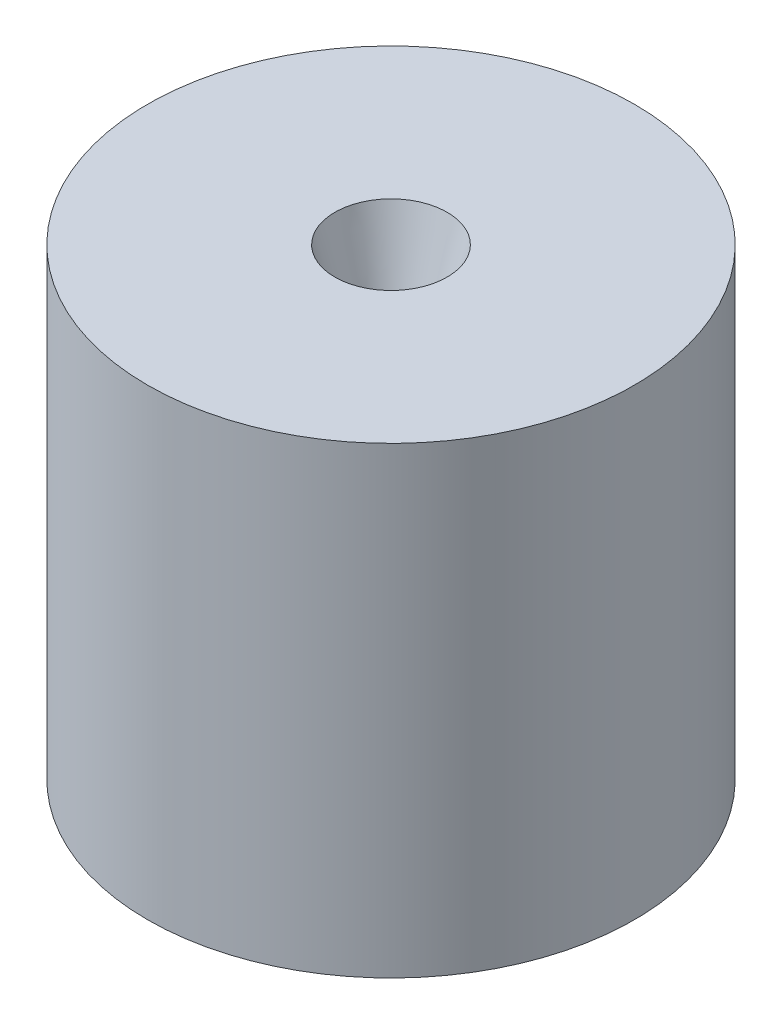
ISO-10303-21;
HEADER;
FILE_DESCRIPTION(('STEP AP214'),'2;1');
FILE_NAME('part.step','',(''),(''),'','','');
FILE_SCHEMA(('AUTOMOTIVE_DESIGN { 1 0 10303 214 1 1 1 1 }'));
ENDSEC;
DATA;
#1=APPLICATION_CONTEXT('core data for automotive mechanical design processes');
#2=APPLICATION_PROTOCOL_DEFINITION('international standard','automotive_design',2000,#1);
#3=PRODUCT_CONTEXT('',#1,'mechanical');
#4=PRODUCT('Part','Part','',(#3));
#5=PRODUCT_RELATED_PRODUCT_CATEGORY('part','',(#4));
#6=PRODUCT_DEFINITION_FORMATION('','',#4);
#7=PRODUCT_DEFINITION_CONTEXT('part definition',#1,'design');
#8=PRODUCT_DEFINITION('design','',#6,#7);
#9=PRODUCT_DEFINITION_SHAPE('','',#8);
#10=(LENGTH_UNIT() NAMED_UNIT(*) SI_UNIT(.MILLI.,.METRE.));
#11=(NAMED_UNIT(*) PLANE_ANGLE_UNIT() SI_UNIT($,.RADIAN.));
#12=(NAMED_UNIT(*) SI_UNIT($,.STERADIAN.) SOLID_ANGLE_UNIT());
#13=UNCERTAINTY_MEASURE_WITH_UNIT(LENGTH_MEASURE(1.E-05),#10,'distance_accuracy_value','');
#14=(GEOMETRIC_REPRESENTATION_CONTEXT(3) GLOBAL_UNCERTAINTY_ASSIGNED_CONTEXT((#13)) GLOBAL_UNIT_ASSIGNED_CONTEXT((#10,
#11,#12)) REPRESENTATION_CONTEXT('',''));
#15=CARTESIAN_POINT('',(0.,0.,0.));
#16=DIRECTION('',(0.,0.,1.));
#17=DIRECTION('',(1.,0.,0.));
#18=AXIS2_PLACEMENT_3D('',#15,#16,#17);
#19=CARTESIAN_POINT('',(0.,2.5,0.));
#20=DIRECTION('',(0.,1.,0.));
#21=DIRECTION('',(0.,0.,1.));
#22=AXIS2_PLACEMENT_3D('',#19,#20,#21);
#23=CONICAL_SURFACE('',#22,0.999999999999996,0.261799387799143);
#24=CARTESIAN_POINT('',(0.,4.36602540378449,0.));
#25=DIRECTION('',(0.,1.,0.));
#26=DIRECTION('',(0.,0.,1.));
#27=AXIS2_PLACEMENT_3D('',#24,#25,#26);
#28=CIRCLE('',#27,1.5);
#29=CARTESIAN_POINT('',(0.,4.36602540378449,1.5));
#30=VERTEX_POINT('',#29);
#31=EDGE_CURVE('E10',#30,#30,#28,.T.);
#32=ORIENTED_EDGE('',*,*,#31,.T.);
#33=EDGE_LOOP('',(#32));
#34=FACE_BOUND('',#33,.T.);
#35=CARTESIAN_POINT('',(0.,2.5,0.));
#36=DIRECTION('',(0.,1.,0.));
#37=DIRECTION('',(0.,0.,1.));
#38=AXIS2_PLACEMENT_3D('',#35,#36,#37);
#39=CIRCLE('',#38,0.999999999999996);
#40=CARTESIAN_POINT('',(0.,2.5,0.999999999999996));
#41=VERTEX_POINT('',#40);
#42=EDGE_CURVE('E49',#41,#41,#39,.T.);
#43=ORIENTED_EDGE('',*,*,#42,.F.);
#44=EDGE_LOOP('',(#43));
#45=FACE_BOUND('',#44,.T.);
#46=ADVANCED_FACE('F30',(#34,#45),#23,.F.);
#47=CARTESIAN_POINT('',(-1.5,4.36602540378449,0.));
#48=DIRECTION('',(0.,1.,0.));
#49=DIRECTION('',(0.,0.,1.));
#50=AXIS2_PLACEMENT_3D('',#47,#48,#49);
#51=PLANE('',#50);
#52=CARTESIAN_POINT('',(0.,4.36602540378449,0.));
#53=DIRECTION('',(0.,1.,0.));
#54=DIRECTION('',(0.,0.,1.));
#55=AXIS2_PLACEMENT_3D('',#52,#53,#54);
#56=CIRCLE('',#55,6.5);
#57=CARTESIAN_POINT('',(0.,4.36602540378449,6.5));
#58=VERTEX_POINT('',#57);
#59=EDGE_CURVE('E36',#58,#58,#56,.T.);
#60=ORIENTED_EDGE('',*,*,#59,.T.);
#61=EDGE_LOOP('',(#60));
#62=FACE_BOUND('',#61,.T.);
#63=ORIENTED_EDGE('',*,*,#31,.F.);
#64=EDGE_LOOP('',(#63));
#65=FACE_BOUND('',#64,.T.);
#66=ADVANCED_FACE('F57',(#62,#65),#51,.T.);
#67=CARTESIAN_POINT('',(0.,20.798274686081,0.));
#68=DIRECTION('',(0.,1.,0.));
#69=DIRECTION('',(0.,0.,1.));
#70=AXIS2_PLACEMENT_3D('',#67,#68,#69);
#71=CYLINDRICAL_SURFACE('',#70,6.5);
#72=CARTESIAN_POINT('',(0.,-7.99999999999998,0.));
#73=DIRECTION('',(0.,1.,0.));
#74=DIRECTION('',(0.,0.,1.));
#75=AXIS2_PLACEMENT_3D('',#72,#73,#74);
#76=CIRCLE('',#75,6.5);
#77=CARTESIAN_POINT('',(0.,-7.99999999999998,-6.5));
#78=VERTEX_POINT('',#77);
#79=EDGE_CURVE('E40',#78,#78,#76,.T.);
#80=ORIENTED_EDGE('',*,*,#79,.T.);
#81=EDGE_LOOP('',(#80));
#82=FACE_BOUND('',#81,.T.);
#83=ORIENTED_EDGE('',*,*,#59,.F.);
#84=EDGE_LOOP('',(#83));
#85=FACE_BOUND('',#84,.T.);
#86=ADVANCED_FACE('F61',(#82,#85),#71,.T.);
#87=CARTESIAN_POINT('',(0.,-7.99999999999998,0.));
#88=DIRECTION('',(0.,-1.,0.));
#89=DIRECTION('',(0.,0.,-1.));
#90=AXIS2_PLACEMENT_3D('',#87,#88,#89);
#91=CONICAL_SURFACE('',#90,6.5,0.78539816339745);
#92=CARTESIAN_POINT('',(0.,-2.5,0.));
#93=DIRECTION('',(0.,1.,0.));
#94=DIRECTION('',(0.,0.,1.));
#95=AXIS2_PLACEMENT_3D('',#92,#93,#94);
#96=CIRCLE('',#95,0.999999999999996);
#97=CARTESIAN_POINT('',(0.,-2.5,-0.999999999999996));
#98=VERTEX_POINT('',#97);
#99=EDGE_CURVE('E44',#98,#98,#96,.T.);
#100=CARTESIAN_POINT('',(0.,-2.5,-0.999999999999996));
#101=CARTESIAN_POINT('',(0.,-2.55729166666667,-1.05729166666666));
#102=CARTESIAN_POINT('',(0.,-2.61458333333333,-1.11458333333333));
#103=CARTESIAN_POINT('',(0.,-2.72916666666666,-1.22916666666666));
#104=CARTESIAN_POINT('',(0.,-2.78645833333333,-1.28645833333333));
#105=CARTESIAN_POINT('',(0.,-2.90104166666666,-1.40104166666666));
#106=CARTESIAN_POINT('',(0.,-2.95833333333333,-1.45833333333333));
#107=CARTESIAN_POINT('',(0.,-3.07291666666666,-1.57291666666666));
#108=CARTESIAN_POINT('',(0.,-3.13020833333333,-1.63020833333333));
#109=CARTESIAN_POINT('',(0.,-3.24479166666666,-1.74479166666666));
#110=CARTESIAN_POINT('',(0.,-3.30208333333333,-1.80208333333333));
#111=CARTESIAN_POINT('',(0.,-3.41666666666666,-1.91666666666666));
#112=CARTESIAN_POINT('',(0.,-3.47395833333333,-1.97395833333333));
#113=CARTESIAN_POINT('',(0.,-3.58854166666666,-2.08854166666666));
#114=CARTESIAN_POINT('',(0.,-3.64583333333333,-2.14583333333333));
#115=CARTESIAN_POINT('',(0.,-3.76041666666666,-2.26041666666666));
#116=CARTESIAN_POINT('',(0.,-3.81770833333333,-2.31770833333333));
#117=CARTESIAN_POINT('',(0.,-3.93229166666666,-2.43229166666666));
#118=CARTESIAN_POINT('',(0.,-3.98958333333333,-2.48958333333333));
#119=CARTESIAN_POINT('',(0.,-4.10416666666666,-2.60416666666666));
#120=CARTESIAN_POINT('',(0.,-4.16145833333333,-2.66145833333333));
#121=CARTESIAN_POINT('',(0.,-4.27604166666666,-2.77604166666666));
#122=CARTESIAN_POINT('',(0.,-4.33333333333333,-2.83333333333333));
#123=CARTESIAN_POINT('',(0.,-4.44791666666666,-2.94791666666666));
#124=CARTESIAN_POINT('',(0.,-4.50520833333333,-3.00520833333333));
#125=CARTESIAN_POINT('',(0.,-4.61979166666666,-3.11979166666666));
#126=CARTESIAN_POINT('',(0.,-4.67708333333333,-3.17708333333333));
#127=CARTESIAN_POINT('',(0.,-4.79166666666666,-3.29166666666666));
#128=CARTESIAN_POINT('',(0.,-4.84895833333333,-3.34895833333333));
#129=CARTESIAN_POINT('',(0.,-4.96354166666666,-3.46354166666666));
#130=CARTESIAN_POINT('',(0.,-5.02083333333333,-3.52083333333333));
#131=CARTESIAN_POINT('',(0.,-5.13541666666666,-3.63541666666666));
#132=CARTESIAN_POINT('',(0.,-5.19270833333332,-3.69270833333333));
#133=CARTESIAN_POINT('',(0.,-5.30729166666666,-3.80729166666666));
#134=CARTESIAN_POINT('',(0.,-5.36458333333332,-3.86458333333333));
#135=CARTESIAN_POINT('',(0.,-5.47916666666666,-3.97916666666666));
#136=CARTESIAN_POINT('',(0.,-5.53645833333332,-4.03645833333333));
#137=CARTESIAN_POINT('',(0.,-5.65104166666666,-4.15104166666666));
#138=CARTESIAN_POINT('',(0.,-5.70833333333332,-4.20833333333333));
#139=CARTESIAN_POINT('',(0.,-5.82291666666666,-4.32291666666666));
#140=CARTESIAN_POINT('',(0.,-5.88020833333332,-4.38020833333333));
#141=CARTESIAN_POINT('',(0.,-5.99479166666666,-4.49479166666666));
#142=CARTESIAN_POINT('',(0.,-6.05208333333332,-4.55208333333333));
#143=CARTESIAN_POINT('',(0.,-6.16666666666666,-4.66666666666666));
#144=CARTESIAN_POINT('',(0.,-6.22395833333332,-4.72395833333333));
#145=CARTESIAN_POINT('',(0.,-6.33854166666665,-4.83854166666666));
#146=CARTESIAN_POINT('',(0.,-6.39583333333332,-4.89583333333333));
#147=CARTESIAN_POINT('',(0.,-6.51041666666665,-5.01041666666666));
#148=CARTESIAN_POINT('',(0.,-6.56770833333332,-5.06770833333333));
#149=CARTESIAN_POINT('',(0.,-6.68229166666665,-5.18229166666666));
#150=CARTESIAN_POINT('',(0.,-6.73958333333332,-5.23958333333333));
#151=CARTESIAN_POINT('',(0.,-6.85416666666665,-5.35416666666666));
#152=CARTESIAN_POINT('',(0.,-6.91145833333332,-5.41145833333333));
#153=CARTESIAN_POINT('',(0.,-7.02604166666665,-5.52604166666666));
#154=CARTESIAN_POINT('',(0.,-7.08333333333332,-5.58333333333333));
#155=CARTESIAN_POINT('',(0.,-7.19791666666665,-5.69791666666666));
#156=CARTESIAN_POINT('',(0.,-7.25520833333332,-5.75520833333333));
#157=CARTESIAN_POINT('',(0.,-7.36979166666665,-5.86979166666666));
#158=CARTESIAN_POINT('',(0.,-7.42708333333332,-5.92708333333333));
#159=CARTESIAN_POINT('',(0.,-7.54166666666665,-6.04166666666666));
#160=CARTESIAN_POINT('',(0.,-7.59895833333332,-6.09895833333333));
#161=CARTESIAN_POINT('',(0.,-7.71354166666665,-6.21354166666666));
#162=CARTESIAN_POINT('',(0.,-7.77083333333332,-6.27083333333333));
#163=CARTESIAN_POINT('',(0.,-7.88541666666665,-6.38541666666666));
#164=CARTESIAN_POINT('',(0.,-7.94270833333332,-6.44270833333333));
#165=CARTESIAN_POINT('',(0.,-7.99999999999998,-6.5));
#166=B_SPLINE_CURVE_WITH_KNOTS('',3,(#100,#101,#102,#103,#104,#105,#106,#107,#108,#109,#110,
#111,#112,#113,#114,#115,#116,#117,#118,#119,#120,#121,#122,#123,#124,#125,#126,#127,#128,#129,
#130,#131,#132,#133,#134,#135,#136,#137,#138,#139,#140,#141,#142,#143,#144,#145,#146,#147,#148,
#149,#150,#151,#152,#153,#154,#155,#156,#157,#158,#159,#160,#161,#162,#163,#164,#165),
.UNSPECIFIED.,.F.,.F.,(4,2,2,2,2,2,2,2,2,2,2,2,2,2,2,2,2,2,2,2,2,2,2,2,2,2,2,2,2,2,2,2,4),(0.,
0.243067956032875,0.486135912065751,0.729203868098626,0.972271824131501,1.21533978016438,
1.45840773619725,1.70147569223013,1.944543648263,2.18761160429588,2.43067956032875,
2.67374751636163,2.9168154723945,3.15988342842738,3.40295138446026,3.64601934049313,
3.88908729652601,4.13215525255888,4.37522320859176,4.61829116462463,4.86135912065751,
5.10442707669038,5.34749503272326,5.59056298875613,5.83363094478901,6.07669890082189,
6.31976685685476,6.56283481288764,6.80590276892051,7.04897072495339,7.29203868098626,
7.53510663701914,7.77817459305201),.UNSPECIFIED.);
#167=EDGE_CURVE('BSEAM65',#98,#78,#166,.T.);
#168=ORIENTED_EDGE('',*,*,#99,.T.);
#169=ORIENTED_EDGE('',*,*,#79,.F.);
#170=ORIENTED_EDGE('',*,*,#167,.T.);
#171=ORIENTED_EDGE('',*,*,#167,.F.);
#172=EDGE_LOOP('',(#168,#170,#169,#171));
#173=FACE_BOUND('',#172,.T.);
#174=ADVANCED_FACE('F65',(#173),#91,.F.);
#175=CARTESIAN_POINT('',(0.,20.798274686081,0.));
#176=DIRECTION('',(0.,1.,0.));
#177=DIRECTION('',(0.,0.,1.));
#178=AXIS2_PLACEMENT_3D('',#175,#176,#177);
#179=CYLINDRICAL_SURFACE('',#178,0.999999999999996);
#180=ORIENTED_EDGE('',*,*,#42,.T.);
#181=EDGE_LOOP('',(#180));
#182=FACE_BOUND('',#181,.T.);
#183=ORIENTED_EDGE('',*,*,#99,.F.);
#184=EDGE_LOOP('',(#183));
#185=FACE_BOUND('',#184,.T.);
#186=ADVANCED_FACE('F53',(#182,#185),#179,.F.);
#187=CLOSED_SHELL('',(#46,#66,#86,#174,#186));
#188=MANIFOLD_SOLID_BREP('B2',#187);
#189=ADVANCED_BREP_SHAPE_REPRESENTATION('',(#18,#188),#14);
#190=SHAPE_DEFINITION_REPRESENTATION(#9,#189);
ENDSEC;
END-ISO-10303-21;
